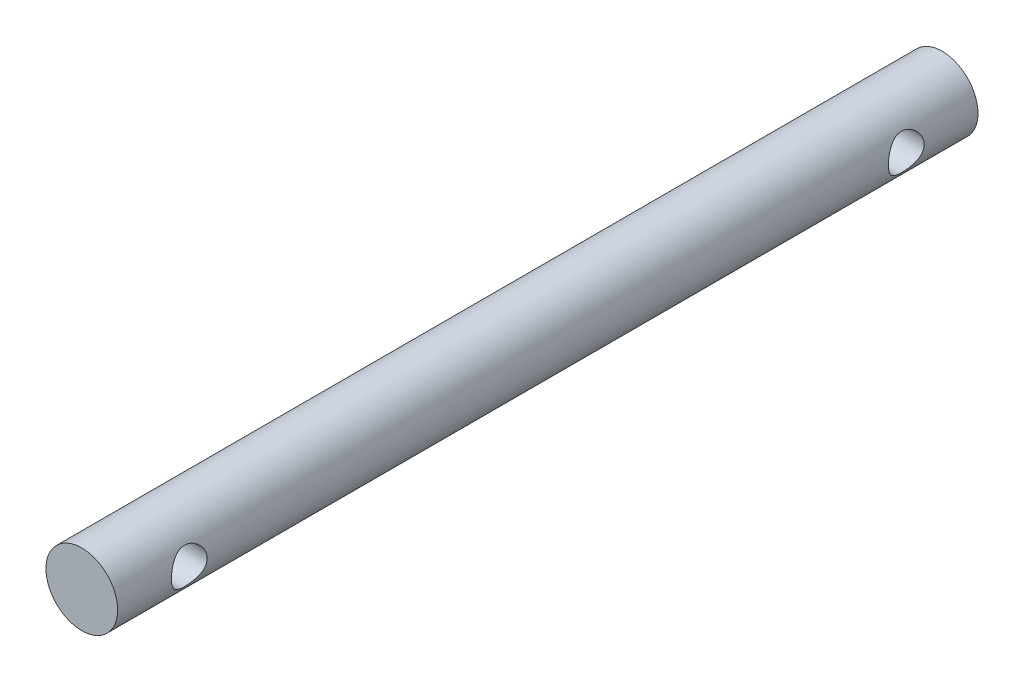
ISO-10303-21;
HEADER;
FILE_DESCRIPTION(('STEP AP214'),'2;1');
FILE_NAME('part.step','',(''),(''),'','','');
FILE_SCHEMA(('AUTOMOTIVE_DESIGN { 1 0 10303 214 1 1 1 1 }'));
ENDSEC;
DATA;
#1=APPLICATION_CONTEXT('core data for automotive mechanical design processes');
#2=APPLICATION_PROTOCOL_DEFINITION('international standard','automotive_design',2000,#1);
#3=PRODUCT_CONTEXT('',#1,'mechanical');
#4=PRODUCT('Part','Part','',(#3));
#5=PRODUCT_RELATED_PRODUCT_CATEGORY('part','',(#4));
#6=PRODUCT_DEFINITION_FORMATION('','',#4);
#7=PRODUCT_DEFINITION_CONTEXT('part definition',#1,'design');
#8=PRODUCT_DEFINITION('design','',#6,#7);
#9=PRODUCT_DEFINITION_SHAPE('','',#8);
#10=(LENGTH_UNIT() NAMED_UNIT(*) SI_UNIT(.MILLI.,.METRE.));
#11=(NAMED_UNIT(*) PLANE_ANGLE_UNIT() SI_UNIT($,.RADIAN.));
#12=(NAMED_UNIT(*) SI_UNIT($,.STERADIAN.) SOLID_ANGLE_UNIT());
#13=UNCERTAINTY_MEASURE_WITH_UNIT(LENGTH_MEASURE(1.E-05),#10,'distance_accuracy_value','');
#14=(GEOMETRIC_REPRESENTATION_CONTEXT(3) GLOBAL_UNCERTAINTY_ASSIGNED_CONTEXT((#13)) GLOBAL_UNIT_ASSIGNED_CONTEXT((#10,
#11,#12)) REPRESENTATION_CONTEXT('',''));
#15=CARTESIAN_POINT('',(0.,0.,0.));
#16=DIRECTION('',(0.,0.,1.));
#17=DIRECTION('',(1.,0.,0.));
#18=AXIS2_PLACEMENT_3D('',#15,#16,#17);
#19=CARTESIAN_POINT('',(0.,0.,60.));
#20=DIRECTION('',(0.,0.,-1.));
#21=DIRECTION('',(-1.,0.,0.));
#22=AXIS2_PLACEMENT_3D('',#19,#20,#21);
#23=CYLINDRICAL_SURFACE('',#22,2.5);
#24=CARTESIAN_POINT('',(2.5,0.,6.25));
#25=CARTESIAN_POINT('',(2.49999641755189,-0.0657149536912331,6.24999587210062));
#26=CARTESIAN_POINT('',(2.49738113774397,-0.131508249622541,6.24478740859791));
#27=CARTESIAN_POINT('',(2.48717695046745,-0.261150294085531,6.22418389957385));
#28=CARTESIAN_POINT('',(2.47957859786229,-0.324995108391879,6.20876950875294));
#29=CARTESIAN_POINT('',(2.46020349254139,-0.448666931100718,6.16850773922901));
#30=CARTESIAN_POINT('',(2.448442989719,-0.508508503673975,6.14369701968999));
#31=CARTESIAN_POINT('',(2.42182220644723,-0.623090771008206,6.08553672329382));
#32=CARTESIAN_POINT('',(2.40696217041912,-0.677831867487562,6.05218781968893));
#33=CARTESIAN_POINT('',(2.37445322822571,-0.784384772202399,5.97560343814338));
#34=CARTESIAN_POINT('',(2.3566899890942,-0.83581901390264,5.93189190095045));
#35=CARTESIAN_POINT('',(2.3207496280843,-0.930974306083722,5.83684815094121));
#36=CARTESIAN_POINT('',(2.30257220261294,-0.974689478883458,5.78551018528445));
#37=CARTESIAN_POINT('',(2.26623688996684,-1.05656500056285,5.67189581309577));
#38=CARTESIAN_POINT('',(2.24818983712665,-1.09403166943955,5.60907987706761));
#39=CARTESIAN_POINT('',(2.21607473465401,-1.15771028361337,5.47704083001723));
#40=CARTESIAN_POINT('',(2.20200384508737,-1.18393026870792,5.40782233909656));
#41=CARTESIAN_POINT('',(2.18072333797261,-1.22266555273574,5.2691686182226));
#42=CARTESIAN_POINT('',(2.17315339479642,-1.23590732135055,5.19999443491576));
#43=CARTESIAN_POINT('',(2.1647736243566,-1.25053374163606,5.06002645277565));
#44=CARTESIAN_POINT('',(2.1639571167911,-1.25193011046634,4.98923432391106));
#45=CARTESIAN_POINT('',(2.16888662821561,-1.24335910896537,4.85714246960579));
#46=CARTESIAN_POINT('',(2.17385954577517,-1.23473069942103,4.79571996097119));
#47=CARTESIAN_POINT('',(2.18845285917313,-1.20867481132117,4.6753476132837));
#48=CARTESIAN_POINT('',(2.1980747353972,-1.19124452987206,4.61639856836836));
#49=CARTESIAN_POINT('',(2.22109345515926,-1.1477622254825,4.50096358429293));
#50=CARTESIAN_POINT('',(2.23457300829998,-1.12151883389499,4.44456700151776));
#51=CARTESIAN_POINT('',(2.26379255351755,-1.061302109585,4.33670713426249));
#52=CARTESIAN_POINT('',(2.27953355975238,-1.02732530476558,4.28524608049989));
#53=CARTESIAN_POINT('',(2.31391447379107,-0.947582568640986,4.18184843407097));
#54=CARTESIAN_POINT('',(2.33266887795933,-0.900868072961602,4.1306789080298));
#55=CARTESIAN_POINT('',(2.36934529125509,-0.799444473426717,4.03658072676137));
#56=CARTESIAN_POINT('',(2.38726689948501,-0.744731570717856,3.99365600995765));
#57=CARTESIAN_POINT('',(2.42127484103705,-0.62564563228981,3.91539292371284));
#58=CARTESIAN_POINT('',(2.43723730202509,-0.56094198949926,3.88049940944282));
#59=CARTESIAN_POINT('',(2.46447351401553,-0.425582769360996,3.82237871369624));
#60=CARTESIAN_POINT('',(2.47575098679441,-0.354931970331596,3.79914226873104));
#61=CARTESIAN_POINT('',(2.49155417176795,-0.215958114575877,3.76690574535416));
#62=CARTESIAN_POINT('',(2.4965617287664,-0.147926913185405,3.75688595531653));
#63=CARTESIAN_POINT('',(2.50091266823877,-0.0109744999366917,3.74816908608189));
#64=CARTESIAN_POINT('',(2.5002587340164,0.057946274837377,3.74946664295065));
#65=CARTESIAN_POINT('',(2.49363990316801,0.189041214982492,3.76275836052344));
#66=CARTESIAN_POINT('',(2.48809057110237,0.251324260062443,3.77391566591254));
#67=CARTESIAN_POINT('',(2.47277714143524,0.373008615377396,3.80529758986886));
#68=CARTESIAN_POINT('',(2.46301257917916,0.432409607113746,3.8255232080667));
#69=CARTESIAN_POINT('',(2.43980314267087,0.548610760562082,3.87499808304147));
#70=CARTESIAN_POINT('',(2.42626102212424,0.605287996257692,3.90448881264602));
#71=CARTESIAN_POINT('',(2.39679967896386,0.713076702123651,3.97138441955755));
#72=CARTESIAN_POINT('',(2.38087944457231,0.764185787219103,4.00879266824179));
#73=CARTESIAN_POINT('',(2.3463527667183,0.864709611613316,4.09470053166609));
#74=CARTESIAN_POINT('',(2.32763606060552,0.913465097280798,4.14392858556696));
#75=CARTESIAN_POINT('',(2.29077989504843,1.00232040139155,4.24990643908663));
#76=CARTESIAN_POINT('',(2.27264084226908,1.04241423211355,4.30666139852047));
#77=CARTESIAN_POINT('',(2.23813990282585,1.11463489312212,4.42955456775039));
#78=CARTESIAN_POINT('',(2.2219066207934,1.1462818698483,4.49601408276074));
#79=CARTESIAN_POINT('',(2.19467590460158,1.19760353251725,4.63438758461565));
#80=CARTESIAN_POINT('',(2.18367172800773,1.21729364485946,4.70629440812648));
#81=CARTESIAN_POINT('',(2.16951876260833,1.2423271093121,4.84613777857681));
#82=CARTESIAN_POINT('',(2.16571729325614,1.24886624550108,4.9137928167863));
#83=CARTESIAN_POINT('',(2.16456693307719,1.25086144297598,5.04930883396341));
#84=CARTESIAN_POINT('',(2.16721524534441,1.2463223082805,5.11716971092429));
#85=CARTESIAN_POINT('',(2.17797327562531,1.22740765699033,5.24435437691502));
#86=CARTESIAN_POINT('',(2.18553868102992,1.2140103929285,5.3038755876805));
#87=CARTESIAN_POINT('',(2.20463770234897,1.17896919778081,5.41976014928088));
#88=CARTESIAN_POINT('',(2.21617259462094,1.15732261394976,5.47612247761496));
#89=CARTESIAN_POINT('',(2.2428566295566,1.10476968162585,5.58828106373326));
#90=CARTESIAN_POINT('',(2.25819652995238,1.07333892227057,5.64378487728713));
#91=CARTESIAN_POINT('',(2.29044164543238,1.00268871454579,5.74909317022573));
#92=CARTESIAN_POINT('',(2.30734767243153,0.96346521404831,5.79889466314811));
#93=CARTESIAN_POINT('',(2.34327903949141,0.872754158330801,5.89767747794702));
#94=CARTESIAN_POINT('',(2.36231229139336,0.820355528762714,5.9458238779524));
#95=CARTESIAN_POINT('',(2.3984719031886,0.70769350777535,6.03282872927954));
#96=CARTESIAN_POINT('',(2.4155972326005,0.647425904070981,6.07168217428286));
#97=CARTESIAN_POINT('',(2.44622511981379,0.519914496024933,6.13904545345276));
#98=CARTESIAN_POINT('',(2.45970120703636,0.452624379918268,6.16748021176429));
#99=CARTESIAN_POINT('',(2.48126676704332,0.313427626617739,6.21226020989869));
#100=CARTESIAN_POINT('',(2.48937154216165,0.241534749528957,6.22863980853697));
#101=CARTESIAN_POINT('',(2.49619327387079,0.140752433104229,6.24237176384481));
#102=CARTESIAN_POINT('',(2.49761706674002,0.112702349299373,6.24522830107952));
#103=CARTESIAN_POINT('',(2.49952121222331,0.0564396647589466,6.24904333189601));
#104=CARTESIAN_POINT('',(2.50000153879704,0.0282270595592265,6.250001773089));
#105=CARTESIAN_POINT('',(2.5,0.,6.25));
#106=B_SPLINE_CURVE_WITH_KNOTS('',3,(#24,#25,#26,#27,#28,#29,#30,#31,#32,#33,#34,#35,#36,#37,
#38,#39,#40,#41,#42,#43,#44,#45,#46,#47,#48,#49,#50,#51,#52,#53,#54,#55,#56,#57,#58,#59,#60,#61,
#62,#63,#64,#65,#66,#67,#68,#69,#70,#71,#72,#73,#74,#75,#76,#77,#78,#79,#80,#81,#82,#83,#84,#85,
#86,#87,#88,#89,#90,#91,#92,#93,#94,#95,#96,#97,#98,#99,#100,#101,#102,#103,#104,#105),
.UNSPECIFIED.,.T.,.F.,(4,2,2,2,2,2,2,2,2,2,2,2,2,2,2,2,2,2,2,2,2,2,2,2,2,2,2,2,2,2,2,2,2,2,2,2,
2,2,2,2,4),(0.,0.197030321775366,0.394435187136497,0.591077694365373,0.787704700726959,
0.996227198397611,1.20490779706754,1.42977158038441,1.65447434872851,1.86572515175287,
2.07676696661275,2.26257140511651,2.44843504907098,2.63862800210609,2.82890651575277,
3.04331176667348,3.25781918248358,3.48228777768051,3.70657771140349,3.91229113089182,
4.11790705639345,4.30758633132652,4.49728652038664,4.69241070034873,4.88761813435424,
5.10199513305523,5.3165198576929,5.54143352699592,5.76605639925972,5.96911634372967,
6.17208824825007,6.35572412805228,6.53941910979597,6.73545570969518,6.93159451423697,
7.15156553440623,7.37165479220716,7.59330017078656,7.81431135781162,7.89894100172122,
7.98357298143558),.UNSPECIFIED.);
#107=CARTESIAN_POINT('',(2.5,0.,6.25));
#108=VERTEX_POINT('',#107);
#109=EDGE_CURVE('E80',#108,#108,#106,.T.);
#110=ORIENTED_EDGE('',*,*,#109,.F.);
#111=EDGE_LOOP('',(#110));
#112=FACE_BOUND('',#111,.T.);
#113=CARTESIAN_POINT('',(2.5,0.,56.25));
#114=CARTESIAN_POINT('',(2.49999641755189,-0.0657149536912337,56.2499958721006));
#115=CARTESIAN_POINT('',(2.49738113774397,-0.131508249622542,56.2447874085979));
#116=CARTESIAN_POINT('',(2.48717695046745,-0.261150294085533,56.2241838995739));
#117=CARTESIAN_POINT('',(2.47957859786229,-0.324995108391881,56.2087695087529));
#118=CARTESIAN_POINT('',(2.46020349254139,-0.448666931100721,56.168507739229));
#119=CARTESIAN_POINT('',(2.448442989719,-0.508508503673981,56.14369701969));
#120=CARTESIAN_POINT('',(2.42182220644723,-0.623090771008212,56.0855367232938));
#121=CARTESIAN_POINT('',(2.40696217041912,-0.677831867487566,56.0521878196889));
#122=CARTESIAN_POINT('',(2.37445322822571,-0.784384772202401,55.9756034381434));
#123=CARTESIAN_POINT('',(2.3566899890942,-0.835819013902642,55.9318919009505));
#124=CARTESIAN_POINT('',(2.3207496280843,-0.930974306083724,55.8368481509412));
#125=CARTESIAN_POINT('',(2.30257220261294,-0.974689478883461,55.7855101852845));
#126=CARTESIAN_POINT('',(2.26623688996684,-1.05656500056285,55.6718958130958));
#127=CARTESIAN_POINT('',(2.24818983712665,-1.09403166943955,55.6090798770676));
#128=CARTESIAN_POINT('',(2.21607473465401,-1.15771028361337,55.4770408300172));
#129=CARTESIAN_POINT('',(2.20200384508737,-1.18393026870792,55.4078223390966));
#130=CARTESIAN_POINT('',(2.1807233379726,-1.22266555273574,55.2691686182226));
#131=CARTESIAN_POINT('',(2.17315339479642,-1.23590732135056,55.1999944349158));
#132=CARTESIAN_POINT('',(2.16477362435659,-1.25053374163606,55.0600264527757));
#133=CARTESIAN_POINT('',(2.1639571167911,-1.25193011046635,54.9892343239111));
#134=CARTESIAN_POINT('',(2.1688866282156,-1.24335910896537,54.8571424696058));
#135=CARTESIAN_POINT('',(2.17385954577517,-1.23473069942103,54.7957199609712));
#136=CARTESIAN_POINT('',(2.18845285917312,-1.20867481132117,54.6753476132837));
#137=CARTESIAN_POINT('',(2.1980747353972,-1.19124452987207,54.6163985683684));
#138=CARTESIAN_POINT('',(2.22109345515926,-1.14776222548251,54.5009635842929));
#139=CARTESIAN_POINT('',(2.23457300829998,-1.121518833895,54.4445670015178));
#140=CARTESIAN_POINT('',(2.26379255351755,-1.061302109585,54.3367071342625));
#141=CARTESIAN_POINT('',(2.27953355975238,-1.02732530476559,54.2852460804999));
#142=CARTESIAN_POINT('',(2.31391447379107,-0.947582568640988,54.181848434071));
#143=CARTESIAN_POINT('',(2.33266887795933,-0.900868072961604,54.1306789080298));
#144=CARTESIAN_POINT('',(2.36934529125509,-0.799444473426718,54.0365807267614));
#145=CARTESIAN_POINT('',(2.38726689948501,-0.744731570717858,53.9936560099576));
#146=CARTESIAN_POINT('',(2.42127484103705,-0.625645632289813,53.9153929237128));
#147=CARTESIAN_POINT('',(2.43723730202509,-0.560941989499263,53.8804994094428));
#148=CARTESIAN_POINT('',(2.46447351401553,-0.425582769361,53.8223787136962));
#149=CARTESIAN_POINT('',(2.47575098679441,-0.3549319703316,53.799142268731));
#150=CARTESIAN_POINT('',(2.49155417176795,-0.215958114575882,53.7669057453542));
#151=CARTESIAN_POINT('',(2.4965617287664,-0.147926913185409,53.7568859553165));
#152=CARTESIAN_POINT('',(2.50091266823877,-0.0109744999366934,53.7481690860819));
#153=CARTESIAN_POINT('',(2.5002587340164,0.0579462748373763,53.7494666429506));
#154=CARTESIAN_POINT('',(2.49363990316801,0.189041214982492,53.7627583605234));
#155=CARTESIAN_POINT('',(2.48809057110237,0.251324260062442,53.7739156659125));
#156=CARTESIAN_POINT('',(2.47277714143524,0.373008615377395,53.8052975898689));
#157=CARTESIAN_POINT('',(2.46301257917916,0.432409607113746,53.8255232080667));
#158=CARTESIAN_POINT('',(2.43980314267087,0.548610760562083,53.8749980830415));
#159=CARTESIAN_POINT('',(2.42626102212424,0.605287996257695,53.904488812646));
#160=CARTESIAN_POINT('',(2.39679967896386,0.713076702123654,53.9713844195575));
#161=CARTESIAN_POINT('',(2.38087944457231,0.764185787219105,54.0087926682418));
#162=CARTESIAN_POINT('',(2.3463527667183,0.864709611613318,54.0947005316661));
#163=CARTESIAN_POINT('',(2.32763606060552,0.9134650972808,54.143928585567));
#164=CARTESIAN_POINT('',(2.29077989504843,1.00232040139155,54.2499064390866));
#165=CARTESIAN_POINT('',(2.27264084226908,1.04241423211355,54.3066613985205));
#166=CARTESIAN_POINT('',(2.23813990282585,1.11463489312212,54.4295545677504));
#167=CARTESIAN_POINT('',(2.2219066207934,1.1462818698483,54.4960140827607));
#168=CARTESIAN_POINT('',(2.19467590460158,1.19760353251726,54.6343875846157));
#169=CARTESIAN_POINT('',(2.18367172800772,1.21729364485947,54.7062944081265));
#170=CARTESIAN_POINT('',(2.16951876260833,1.2423271093121,54.8461377785768));
#171=CARTESIAN_POINT('',(2.16571729325614,1.24886624550108,54.9137928167863));
#172=CARTESIAN_POINT('',(2.16456693307718,1.25086144297599,55.0493088339634));
#173=CARTESIAN_POINT('',(2.1672152453444,1.2463223082805,55.1171697109243));
#174=CARTESIAN_POINT('',(2.17797327562531,1.22740765699033,55.244354376915));
#175=CARTESIAN_POINT('',(2.18553868102992,1.2140103929285,55.3038755876805));
#176=CARTESIAN_POINT('',(2.20463770234897,1.17896919778081,55.4197601492809));
#177=CARTESIAN_POINT('',(2.21617259462094,1.15732261394977,55.476122477615));
#178=CARTESIAN_POINT('',(2.2428566295566,1.10476968162586,55.5882810637333));
#179=CARTESIAN_POINT('',(2.25819652995238,1.07333892227057,55.6437848772871));
#180=CARTESIAN_POINT('',(2.29044164543238,1.00268871454579,55.7490931702257));
#181=CARTESIAN_POINT('',(2.30734767243152,0.963465214048313,55.7988946631481));
#182=CARTESIAN_POINT('',(2.34327903949141,0.872754158330806,55.897677477947));
#183=CARTESIAN_POINT('',(2.36231229139336,0.820355528762719,55.9458238779524));
#184=CARTESIAN_POINT('',(2.39847190318859,0.707693507775353,56.0328287292795));
#185=CARTESIAN_POINT('',(2.4155972326005,0.647425904070983,56.0716821742829));
#186=CARTESIAN_POINT('',(2.44622511981379,0.519914496024934,56.1390454534528));
#187=CARTESIAN_POINT('',(2.45970120703636,0.452624379918269,56.1674802117643));
#188=CARTESIAN_POINT('',(2.48126676704332,0.31342762661774,56.2122602098987));
#189=CARTESIAN_POINT('',(2.48937154216165,0.241534749528958,56.228639808537));
#190=CARTESIAN_POINT('',(2.49619327387079,0.140752433104229,56.2423717638448));
#191=CARTESIAN_POINT('',(2.49761706674002,0.112702349299373,56.2452283010795));
#192=CARTESIAN_POINT('',(2.49952121222331,0.0564396647589465,56.249043331896));
#193=CARTESIAN_POINT('',(2.50000153879704,0.0282270595592263,56.250001773089));
#194=CARTESIAN_POINT('',(2.5,0.,56.25));
#195=B_SPLINE_CURVE_WITH_KNOTS('',3,(#113,#114,#115,#116,#117,#118,#119,#120,#121,#122,#123,
#124,#125,#126,#127,#128,#129,#130,#131,#132,#133,#134,#135,#136,#137,#138,#139,#140,#141,#142,
#143,#144,#145,#146,#147,#148,#149,#150,#151,#152,#153,#154,#155,#156,#157,#158,#159,#160,#161,
#162,#163,#164,#165,#166,#167,#168,#169,#170,#171,#172,#173,#174,#175,#176,#177,#178,#179,#180,
#181,#182,#183,#184,#185,#186,#187,#188,#189,#190,#191,#192,#193,#194),.UNSPECIFIED.,.T.,.F.,(4,
2,2,2,2,2,2,2,2,2,2,2,2,2,2,2,2,2,2,2,2,2,2,2,2,2,2,2,2,2,2,2,2,2,2,2,2,2,2,2,4),(0.,
0.197030321775366,0.394435187136499,0.59107769436538,0.787704700726964,0.996227198397612,
1.20490779706755,1.42977158038441,1.65447434872852,1.86572515175288,2.07676696661277,
2.2625714051165,2.44843504907099,2.63862800210611,2.82890651575278,3.04331176667349,
3.25781918248359,3.48228777768052,3.7065777114035,3.91229113089183,4.11790705639346,
4.30758633132654,4.49728652038666,4.69241070034875,4.88761813435425,5.10199513305525,
5.31651985769292,5.54143352699595,5.76605639925974,5.96911634372969,6.17208824825009,
6.3557241280523,6.539419109796,6.7354557096952,6.93159451423699,7.15156553440625,
7.37165479220718,7.59330017078659,7.81431135781165,7.89894100172125,7.98357298143561),.UNSPECIFIED.);
#196=CARTESIAN_POINT('',(2.5,0.,56.25));
#197=VERTEX_POINT('',#196);
#198=EDGE_CURVE('E49',#197,#197,#195,.T.);
#199=ORIENTED_EDGE('',*,*,#198,.F.);
#200=EDGE_LOOP('',(#199));
#201=FACE_BOUND('',#200,.T.);
#202=CARTESIAN_POINT('',(0.,0.,60.));
#203=DIRECTION('',(0.,0.,1.));
#204=DIRECTION('',(1.,0.,0.));
#205=AXIS2_PLACEMENT_3D('',#202,#203,#204);
#206=CIRCLE('',#205,2.5);
#207=CARTESIAN_POINT('',(2.5,0.,60.));
#208=VERTEX_POINT('',#207);
#209=EDGE_CURVE('E10',#208,#208,#206,.T.);
#210=ORIENTED_EDGE('',*,*,#209,.F.);
#211=EDGE_LOOP('',(#210));
#212=FACE_BOUND('',#211,.T.);
#213=CARTESIAN_POINT('',(0.,0.,0.));
#214=DIRECTION('',(0.,0.,1.));
#215=DIRECTION('',(1.,0.,0.));
#216=AXIS2_PLACEMENT_3D('',#213,#214,#215);
#217=CIRCLE('',#216,2.5);
#218=CARTESIAN_POINT('',(2.5,0.,0.));
#219=VERTEX_POINT('',#218);
#220=EDGE_CURVE('E41',#219,#219,#217,.T.);
#221=ORIENTED_EDGE('',*,*,#220,.T.);
#222=EDGE_LOOP('',(#221));
#223=FACE_BOUND('',#222,.T.);
#224=CARTESIAN_POINT('',(-2.5,0.,56.25));
#225=CARTESIAN_POINT('',(-2.49999641755189,0.0657149536912334,56.2499958721006));
#226=CARTESIAN_POINT('',(-2.49738113774397,0.131508249622542,56.2447874085979));
#227=CARTESIAN_POINT('',(-2.48717695046745,0.261150294085533,56.2241838995739));
#228=CARTESIAN_POINT('',(-2.47957859786229,0.324995108391881,56.2087695087529));
#229=CARTESIAN_POINT('',(-2.46020349254139,0.44866693110072,56.168507739229));
#230=CARTESIAN_POINT('',(-2.448442989719,0.508508503673978,56.14369701969));
#231=CARTESIAN_POINT('',(-2.42182220644723,0.623090771008209,56.0855367232938));
#232=CARTESIAN_POINT('',(-2.40696217041912,0.677831867487564,56.0521878196889));
#233=CARTESIAN_POINT('',(-2.37445322822571,0.784384772202401,55.9756034381434));
#234=CARTESIAN_POINT('',(-2.3566899890942,0.835819013902644,55.9318919009505));
#235=CARTESIAN_POINT('',(-2.3207496280843,0.930974306083726,55.8368481509412));
#236=CARTESIAN_POINT('',(-2.30257220261294,0.974689478883461,55.7855101852845));
#237=CARTESIAN_POINT('',(-2.26623688996684,1.05656500056285,55.6718958130958));
#238=CARTESIAN_POINT('',(-2.24818983712664,1.09403166943955,55.6090798770676));
#239=CARTESIAN_POINT('',(-2.216074734654,1.15771028361338,55.4770408300172));
#240=CARTESIAN_POINT('',(-2.20200384508737,1.18393026870792,55.4078223390966));
#241=CARTESIAN_POINT('',(-2.1807233379726,1.22266555273574,55.2691686182226));
#242=CARTESIAN_POINT('',(-2.17315339479642,1.23590732135056,55.1999944349158));
#243=CARTESIAN_POINT('',(-2.16477362435659,1.25053374163606,55.0600264527757));
#244=CARTESIAN_POINT('',(-2.1639571167911,1.25193011046635,54.9892343239111));
#245=CARTESIAN_POINT('',(-2.1688866282156,1.24335910896537,54.8571424696058));
#246=CARTESIAN_POINT('',(-2.17385954577517,1.23473069942103,54.7957199609712));
#247=CARTESIAN_POINT('',(-2.18845285917312,1.20867481132117,54.6753476132837));
#248=CARTESIAN_POINT('',(-2.1980747353972,1.19124452987207,54.6163985683684));
#249=CARTESIAN_POINT('',(-2.22109345515926,1.14776222548251,54.5009635842929));
#250=CARTESIAN_POINT('',(-2.23457300829998,1.12151883389499,54.4445670015178));
#251=CARTESIAN_POINT('',(-2.26379255351754,1.061302109585,54.3367071342625));
#252=CARTESIAN_POINT('',(-2.27953355975238,1.02732530476559,54.2852460804999));
#253=CARTESIAN_POINT('',(-2.31391447379107,0.947582568640987,54.181848434071));
#254=CARTESIAN_POINT('',(-2.33266887795933,0.900868072961603,54.1306789080298));
#255=CARTESIAN_POINT('',(-2.36934529125509,0.799444473426717,54.0365807267614));
#256=CARTESIAN_POINT('',(-2.38726689948501,0.744731570717858,53.9936560099576));
#257=CARTESIAN_POINT('',(-2.42127484103705,0.62564563228981,53.9153929237128));
#258=CARTESIAN_POINT('',(-2.43723730202509,0.560941989499259,53.8804994094428));
#259=CARTESIAN_POINT('',(-2.46447351401553,0.425582769360992,53.8223787136962));
#260=CARTESIAN_POINT('',(-2.47575098679441,0.354931970331593,53.799142268731));
#261=CARTESIAN_POINT('',(-2.49155417176795,0.215958114575875,53.7669057453542));
#262=CARTESIAN_POINT('',(-2.4965617287664,0.147926913185403,53.7568859553165));
#263=CARTESIAN_POINT('',(-2.50091266823877,0.0109744999366901,53.7481690860819));
#264=CARTESIAN_POINT('',(-2.5002587340164,-0.0579462748373784,53.7494666429506));
#265=CARTESIAN_POINT('',(-2.49363990316801,-0.189041214982494,53.7627583605234));
#266=CARTESIAN_POINT('',(-2.48809057110237,-0.251324260062446,53.7739156659125));
#267=CARTESIAN_POINT('',(-2.47277714143524,-0.373008615377399,53.8052975898689));
#268=CARTESIAN_POINT('',(-2.46301257917916,-0.432409607113748,53.8255232080667));
#269=CARTESIAN_POINT('',(-2.43980314267087,-0.548610760562085,53.8749980830415));
#270=CARTESIAN_POINT('',(-2.42626102212424,-0.605287996257696,53.904488812646));
#271=CARTESIAN_POINT('',(-2.39679967896386,-0.713076702123657,53.9713844195575));
#272=CARTESIAN_POINT('',(-2.38087944457231,-0.764185787219107,54.0087926682418));
#273=CARTESIAN_POINT('',(-2.3463527667183,-0.86470961161332,54.0947005316661));
#274=CARTESIAN_POINT('',(-2.32763606060551,-0.913465097280801,54.143928585567));
#275=CARTESIAN_POINT('',(-2.29077989504843,-1.00232040139155,54.2499064390866));
#276=CARTESIAN_POINT('',(-2.27264084226908,-1.04241423211356,54.3066613985205));
#277=CARTESIAN_POINT('',(-2.23813990282585,-1.11463489312213,54.4295545677504));
#278=CARTESIAN_POINT('',(-2.2219066207934,-1.1462818698483,54.4960140827607));
#279=CARTESIAN_POINT('',(-2.19467590460157,-1.19760353251726,54.6343875846157));
#280=CARTESIAN_POINT('',(-2.18367172800772,-1.21729364485947,54.7062944081265));
#281=CARTESIAN_POINT('',(-2.16951876260833,-1.2423271093121,54.8461377785768));
#282=CARTESIAN_POINT('',(-2.16571729325614,-1.24886624550109,54.9137928167863));
#283=CARTESIAN_POINT('',(-2.16456693307718,-1.25086144297599,55.0493088339634));
#284=CARTESIAN_POINT('',(-2.1672152453444,-1.2463223082805,55.1171697109243));
#285=CARTESIAN_POINT('',(-2.17797327562531,-1.22740765699033,55.244354376915));
#286=CARTESIAN_POINT('',(-2.18553868102992,-1.2140103929285,55.3038755876805));
#287=CARTESIAN_POINT('',(-2.20463770234897,-1.17896919778081,55.4197601492809));
#288=CARTESIAN_POINT('',(-2.21617259462094,-1.15732261394977,55.476122477615));
#289=CARTESIAN_POINT('',(-2.2428566295566,-1.10476968162586,55.5882810637333));
#290=CARTESIAN_POINT('',(-2.25819652995238,-1.07333892227057,55.6437848772871));
#291=CARTESIAN_POINT('',(-2.29044164543238,-1.00268871454579,55.7490931702257));
#292=CARTESIAN_POINT('',(-2.30734767243152,-0.963465214048314,55.7988946631481));
#293=CARTESIAN_POINT('',(-2.34327903949141,-0.872754158330807,55.897677477947));
#294=CARTESIAN_POINT('',(-2.36231229139336,-0.82035552876272,55.9458238779524));
#295=CARTESIAN_POINT('',(-2.39847190318859,-0.707693507775354,56.0328287292795));
#296=CARTESIAN_POINT('',(-2.4155972326005,-0.647425904070984,56.0716821742829));
#297=CARTESIAN_POINT('',(-2.44622511981379,-0.519914496024936,56.1390454534528));
#298=CARTESIAN_POINT('',(-2.45970120703636,-0.452624379918271,56.1674802117643));
#299=CARTESIAN_POINT('',(-2.48126676704332,-0.313427626617743,56.2122602098987));
#300=CARTESIAN_POINT('',(-2.48937154216165,-0.241534749528961,56.228639808537));
#301=CARTESIAN_POINT('',(-2.49619327387079,-0.140752433104233,56.2423717638448));
#302=CARTESIAN_POINT('',(-2.49761706674002,-0.112702349299376,56.2452283010795));
#303=CARTESIAN_POINT('',(-2.49952121222331,-0.0564396647589482,56.249043331896));
#304=CARTESIAN_POINT('',(-2.50000153879704,-0.0282270595592274,56.250001773089));
#305=CARTESIAN_POINT('',(-2.5,0.,56.25));
#306=B_SPLINE_CURVE_WITH_KNOTS('',3,(#224,#225,#226,#227,#228,#229,#230,#231,#232,#233,#234,
#235,#236,#237,#238,#239,#240,#241,#242,#243,#244,#245,#246,#247,#248,#249,#250,#251,#252,#253,
#254,#255,#256,#257,#258,#259,#260,#261,#262,#263,#264,#265,#266,#267,#268,#269,#270,#271,#272,
#273,#274,#275,#276,#277,#278,#279,#280,#281,#282,#283,#284,#285,#286,#287,#288,#289,#290,#291,
#292,#293,#294,#295,#296,#297,#298,#299,#300,#301,#302,#303,#304,#305),.UNSPECIFIED.,.T.,.F.,(4,
2,2,2,2,2,2,2,2,2,2,2,2,2,2,2,2,2,2,2,2,2,2,2,2,2,2,2,2,2,2,2,2,2,2,2,2,2,2,2,4),(0.,
0.197030321775366,0.394435187136499,0.591077694365377,0.787704700726964,0.996227198397614,
1.20490779706755,1.42977158038442,1.65447434872852,1.86572515175288,2.07676696661277,
2.2625714051165,2.44843504907098,2.63862800210611,2.82890651575278,3.04331176667349,
3.25781918248359,3.48228777768053,3.70657771140351,3.91229113089184,4.11790705639346,
4.30758633132654,4.49728652038666,4.69241070034875,4.88761813435426,5.10199513305525,
5.31651985769292,5.54143352699595,5.76605639925974,5.96911634372969,6.17208824825009,
6.3557241280523,6.539419109796,6.7354557096952,6.93159451423699,7.15156553440626,
7.37165479220719,7.59330017078659,7.81431135781165,7.89894100172125,7.98357298143561),.UNSPECIFIED.);
#307=CARTESIAN_POINT('',(-2.5,0.,56.25));
#308=VERTEX_POINT('',#307);
#309=EDGE_CURVE('E46',#308,#308,#306,.T.);
#310=ORIENTED_EDGE('',*,*,#309,.F.);
#311=EDGE_LOOP('',(#310));
#312=FACE_BOUND('',#311,.T.);
#313=CARTESIAN_POINT('',(-2.5,0.,6.25));
#314=CARTESIAN_POINT('',(-2.49999641755189,0.0657149536912333,6.24999587210062));
#315=CARTESIAN_POINT('',(-2.49738113774397,0.131508249622541,6.24478740859791));
#316=CARTESIAN_POINT('',(-2.48717695046745,0.261150294085532,6.22418389957385));
#317=CARTESIAN_POINT('',(-2.47957859786229,0.32499510839188,6.20876950875294));
#318=CARTESIAN_POINT('',(-2.46020349254139,0.448666931100718,6.16850773922901));
#319=CARTESIAN_POINT('',(-2.448442989719,0.508508503673975,6.14369701968999));
#320=CARTESIAN_POINT('',(-2.42182220644723,0.623090771008206,6.08553672329383));
#321=CARTESIAN_POINT('',(-2.40696217041912,0.677831867487562,6.05218781968893));
#322=CARTESIAN_POINT('',(-2.37445322822571,0.784384772202399,5.97560343814338));
#323=CARTESIAN_POINT('',(-2.3566899890942,0.83581901390264,5.93189190095045));
#324=CARTESIAN_POINT('',(-2.3207496280843,0.930974306083722,5.83684815094121));
#325=CARTESIAN_POINT('',(-2.30257220261294,0.974689478883458,5.78551018528445));
#326=CARTESIAN_POINT('',(-2.26623688996684,1.05656500056285,5.67189581309577));
#327=CARTESIAN_POINT('',(-2.24818983712665,1.09403166943955,5.60907987706761));
#328=CARTESIAN_POINT('',(-2.21607473465401,1.15771028361337,5.47704083001723));
#329=CARTESIAN_POINT('',(-2.20200384508737,1.18393026870792,5.40782233909656));
#330=CARTESIAN_POINT('',(-2.18072333797261,1.22266555273574,5.2691686182226));
#331=CARTESIAN_POINT('',(-2.17315339479642,1.23590732135055,5.19999443491576));
#332=CARTESIAN_POINT('',(-2.1647736243566,1.25053374163606,5.06002645277565));
#333=CARTESIAN_POINT('',(-2.1639571167911,1.25193011046634,4.98923432391106));
#334=CARTESIAN_POINT('',(-2.16888662821561,1.24335910896537,4.85714246960579));
#335=CARTESIAN_POINT('',(-2.17385954577517,1.23473069942103,4.79571996097119));
#336=CARTESIAN_POINT('',(-2.18845285917313,1.20867481132117,4.6753476132837));
#337=CARTESIAN_POINT('',(-2.1980747353972,1.19124452987206,4.61639856836836));
#338=CARTESIAN_POINT('',(-2.22109345515926,1.1477622254825,4.50096358429293));
#339=CARTESIAN_POINT('',(-2.23457300829998,1.12151883389499,4.44456700151776));
#340=CARTESIAN_POINT('',(-2.26379255351755,1.061302109585,4.33670713426249));
#341=CARTESIAN_POINT('',(-2.27953355975238,1.02732530476558,4.28524608049989));
#342=CARTESIAN_POINT('',(-2.31391447379107,0.947582568640985,4.18184843407097));
#343=CARTESIAN_POINT('',(-2.33266887795933,0.900868072961601,4.1306789080298));
#344=CARTESIAN_POINT('',(-2.36934529125509,0.799444473426716,4.03658072676137));
#345=CARTESIAN_POINT('',(-2.38726689948501,0.744731570717856,3.99365600995765));
#346=CARTESIAN_POINT('',(-2.42127484103705,0.62564563228981,3.91539292371284));
#347=CARTESIAN_POINT('',(-2.43723730202509,0.56094198949926,3.88049940944282));
#348=CARTESIAN_POINT('',(-2.46447351401553,0.425582769360996,3.82237871369624));
#349=CARTESIAN_POINT('',(-2.47575098679441,0.354931970331595,3.79914226873104));
#350=CARTESIAN_POINT('',(-2.49155417176795,0.215958114575877,3.76690574535416));
#351=CARTESIAN_POINT('',(-2.4965617287664,0.147926913185405,3.75688595531653));
#352=CARTESIAN_POINT('',(-2.50091266823877,0.0109744999366919,3.74816908608189));
#353=CARTESIAN_POINT('',(-2.5002587340164,-0.057946274837377,3.74946664295065));
#354=CARTESIAN_POINT('',(-2.49363990316801,-0.189041214982493,3.76275836052344));
#355=CARTESIAN_POINT('',(-2.48809057110237,-0.251324260062443,3.77391566591254));
#356=CARTESIAN_POINT('',(-2.47277714143524,-0.373008615377397,3.80529758986886));
#357=CARTESIAN_POINT('',(-2.46301257917916,-0.432409607113746,3.8255232080667));
#358=CARTESIAN_POINT('',(-2.43980314267087,-0.548610760562082,3.87499808304147));
#359=CARTESIAN_POINT('',(-2.42626102212424,-0.605287996257692,3.90448881264602));
#360=CARTESIAN_POINT('',(-2.39679967896386,-0.713076702123651,3.97138441955755));
#361=CARTESIAN_POINT('',(-2.38087944457231,-0.764185787219103,4.00879266824179));
#362=CARTESIAN_POINT('',(-2.3463527667183,-0.864709611613317,4.09470053166609));
#363=CARTESIAN_POINT('',(-2.32763606060552,-0.913465097280799,4.14392858556696));
#364=CARTESIAN_POINT('',(-2.29077989504843,-1.00232040139155,4.24990643908663));
#365=CARTESIAN_POINT('',(-2.27264084226908,-1.04241423211355,4.30666139852047));
#366=CARTESIAN_POINT('',(-2.23813990282585,-1.11463489312212,4.42955456775039));
#367=CARTESIAN_POINT('',(-2.2219066207934,-1.1462818698483,4.49601408276074));
#368=CARTESIAN_POINT('',(-2.19467590460158,-1.19760353251725,4.63438758461565));
#369=CARTESIAN_POINT('',(-2.18367172800773,-1.21729364485946,4.70629440812648));
#370=CARTESIAN_POINT('',(-2.16951876260833,-1.2423271093121,4.84613777857681));
#371=CARTESIAN_POINT('',(-2.16571729325614,-1.24886624550108,4.9137928167863));
#372=CARTESIAN_POINT('',(-2.16456693307719,-1.25086144297598,5.04930883396341));
#373=CARTESIAN_POINT('',(-2.16721524534441,-1.2463223082805,5.11716971092429));
#374=CARTESIAN_POINT('',(-2.17797327562531,-1.22740765699033,5.24435437691502));
#375=CARTESIAN_POINT('',(-2.18553868102992,-1.2140103929285,5.3038755876805));
#376=CARTESIAN_POINT('',(-2.20463770234897,-1.17896919778081,5.41976014928088));
#377=CARTESIAN_POINT('',(-2.21617259462094,-1.15732261394976,5.47612247761496));
#378=CARTESIAN_POINT('',(-2.2428566295566,-1.10476968162585,5.58828106373326));
#379=CARTESIAN_POINT('',(-2.25819652995238,-1.07333892227057,5.64378487728713));
#380=CARTESIAN_POINT('',(-2.29044164543238,-1.00268871454579,5.74909317022573));
#381=CARTESIAN_POINT('',(-2.30734767243153,-0.96346521404831,5.79889466314811));
#382=CARTESIAN_POINT('',(-2.34327903949141,-0.872754158330801,5.89767747794702));
#383=CARTESIAN_POINT('',(-2.36231229139336,-0.820355528762714,5.9458238779524));
#384=CARTESIAN_POINT('',(-2.3984719031886,-0.70769350777535,6.03282872927954));
#385=CARTESIAN_POINT('',(-2.4155972326005,-0.647425904070981,6.07168217428286));
#386=CARTESIAN_POINT('',(-2.44622511981379,-0.519914496024933,6.13904545345276));
#387=CARTESIAN_POINT('',(-2.45970120703636,-0.452624379918267,6.16748021176429));
#388=CARTESIAN_POINT('',(-2.48126676704332,-0.313427626617739,6.21226020989869));
#389=CARTESIAN_POINT('',(-2.48937154216165,-0.241534749528957,6.22863980853697));
#390=CARTESIAN_POINT('',(-2.49619327387079,-0.14075243310423,6.24237176384481));
#391=CARTESIAN_POINT('',(-2.49761706674002,-0.112702349299373,6.24522830107952));
#392=CARTESIAN_POINT('',(-2.49952121222331,-0.056439664758947,6.24904333189601));
#393=CARTESIAN_POINT('',(-2.50000153879704,-0.0282270595592267,6.250001773089));
#394=CARTESIAN_POINT('',(-2.5,0.,6.25));
#395=B_SPLINE_CURVE_WITH_KNOTS('',3,(#313,#314,#315,#316,#317,#318,#319,#320,#321,#322,#323,
#324,#325,#326,#327,#328,#329,#330,#331,#332,#333,#334,#335,#336,#337,#338,#339,#340,#341,#342,
#343,#344,#345,#346,#347,#348,#349,#350,#351,#352,#353,#354,#355,#356,#357,#358,#359,#360,#361,
#362,#363,#364,#365,#366,#367,#368,#369,#370,#371,#372,#373,#374,#375,#376,#377,#378,#379,#380,
#381,#382,#383,#384,#385,#386,#387,#388,#389,#390,#391,#392,#393,#394),.UNSPECIFIED.,.T.,.F.,(4,
2,2,2,2,2,2,2,2,2,2,2,2,2,2,2,2,2,2,2,2,2,2,2,2,2,2,2,2,2,2,2,2,2,2,2,2,2,2,2,4),(0.,
0.197030321775366,0.394435187136497,0.591077694365373,0.787704700726959,0.996227198397611,
1.20490779706754,1.42977158038441,1.65447434872851,1.86572515175287,2.07676696661275,
2.26257140511651,2.44843504907098,2.63862800210609,2.82890651575277,3.04331176667348,
3.25781918248358,3.48228777768051,3.70657771140349,3.91229113089182,4.11790705639345,
4.30758633132653,4.49728652038664,4.69241070034873,4.88761813435424,5.10199513305524,
5.3165198576929,5.54143352699592,5.76605639925972,5.96911634372967,6.17208824825007,
6.35572412805228,6.53941910979598,6.73545570969518,6.93159451423697,7.15156553440623,
7.37165479220716,7.59330017078656,7.81431135781163,7.89894100172122,7.98357298143558),.UNSPECIFIED.);
#396=CARTESIAN_POINT('',(-2.5,0.,6.25));
#397=VERTEX_POINT('',#396);
#398=EDGE_CURVE('E34',#397,#397,#395,.T.);
#399=ORIENTED_EDGE('',*,*,#398,.F.);
#400=EDGE_LOOP('',(#399));
#401=FACE_BOUND('',#400,.T.);
#402=ADVANCED_FACE('F30',(#112,#201,#212,#223,#312,#401),#23,.T.);
#403=CARTESIAN_POINT('',(0.,0.,60.));
#404=DIRECTION('',(0.,0.,1.));
#405=DIRECTION('',(1.,0.,0.));
#406=AXIS2_PLACEMENT_3D('',#403,#404,#405);
#407=PLANE('',#406);
#408=ORIENTED_EDGE('',*,*,#209,.T.);
#409=EDGE_LOOP('',(#408));
#410=FACE_BOUND('',#409,.T.);
#411=ADVANCED_FACE('F65',(#410),#407,.T.);
#412=CARTESIAN_POINT('',(0.,0.,0.));
#413=DIRECTION('',(0.,0.,1.));
#414=DIRECTION('',(1.,0.,0.));
#415=AXIS2_PLACEMENT_3D('',#412,#413,#414);
#416=PLANE('',#415);
#417=ORIENTED_EDGE('',*,*,#220,.F.);
#418=EDGE_LOOP('',(#417));
#419=FACE_BOUND('',#418,.T.);
#420=ADVANCED_FACE('F62',(#419),#416,.F.);
#421=CARTESIAN_POINT('',(10.,0.,55.));
#422=DIRECTION('',(-1.,0.,0.));
#423=DIRECTION('',(0.,0.,1.));
#424=AXIS2_PLACEMENT_3D('',#421,#422,#423);
#425=CYLINDRICAL_SURFACE('',#424,1.25);
#426=ORIENTED_EDGE('',*,*,#198,.T.);
#427=EDGE_LOOP('',(#426));
#428=FACE_BOUND('',#427,.T.);
#429=ORIENTED_EDGE('',*,*,#309,.T.);
#430=EDGE_LOOP('',(#429));
#431=FACE_BOUND('',#430,.T.);
#432=ADVANCED_FACE('F57',(#428,#431),#425,.F.);
#433=CARTESIAN_POINT('',(10.,0.,5.));
#434=DIRECTION('',(-1.,0.,0.));
#435=DIRECTION('',(0.,0.,1.));
#436=AXIS2_PLACEMENT_3D('',#433,#434,#435);
#437=CYLINDRICAL_SURFACE('',#436,1.25);
#438=ORIENTED_EDGE('',*,*,#109,.T.);
#439=EDGE_LOOP('',(#438));
#440=FACE_BOUND('',#439,.T.);
#441=ORIENTED_EDGE('',*,*,#398,.T.);
#442=EDGE_LOOP('',(#441));
#443=FACE_BOUND('',#442,.T.);
#444=ADVANCED_FACE('F61',(#440,#443),#437,.F.);
#445=CLOSED_SHELL('',(#402,#411,#420,#432,#444));
#446=MANIFOLD_SOLID_BREP('B2',#445);
#447=ADVANCED_BREP_SHAPE_REPRESENTATION('',(#18,#446),#14);
#448=SHAPE_DEFINITION_REPRESENTATION(#9,#447);
ENDSEC;
END-ISO-10303-21;
